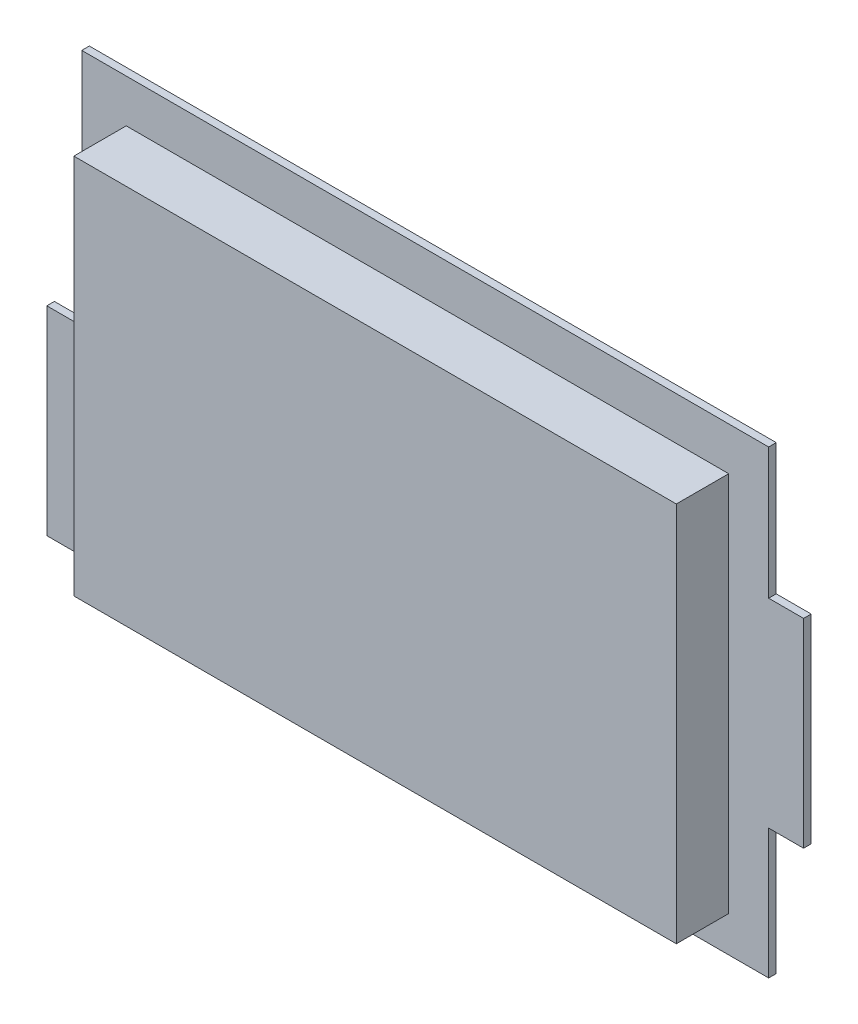
ISO-10303-21;
HEADER;
FILE_DESCRIPTION(('STEP AP214'),'2;1');
FILE_NAME('part.step','',(''),(''),'','','');
FILE_SCHEMA(('AUTOMOTIVE_DESIGN { 1 0 10303 214 1 1 1 1 }'));
ENDSEC;
DATA;
#1=APPLICATION_CONTEXT('core data for automotive mechanical design processes');
#2=APPLICATION_PROTOCOL_DEFINITION('international standard','automotive_design',2000,#1);
#3=PRODUCT_CONTEXT('',#1,'mechanical');
#4=PRODUCT('Part','Part','',(#3));
#5=PRODUCT_RELATED_PRODUCT_CATEGORY('part','',(#4));
#6=PRODUCT_DEFINITION_FORMATION('','',#4);
#7=PRODUCT_DEFINITION_CONTEXT('part definition',#1,'design');
#8=PRODUCT_DEFINITION('design','',#6,#7);
#9=PRODUCT_DEFINITION_SHAPE('','',#8);
#10=(LENGTH_UNIT() NAMED_UNIT(*) SI_UNIT(.MILLI.,.METRE.));
#11=(NAMED_UNIT(*) PLANE_ANGLE_UNIT() SI_UNIT($,.RADIAN.));
#12=(NAMED_UNIT(*) SI_UNIT($,.STERADIAN.) SOLID_ANGLE_UNIT());
#13=UNCERTAINTY_MEASURE_WITH_UNIT(LENGTH_MEASURE(1.E-05),#10,'distance_accuracy_value','');
#14=(GEOMETRIC_REPRESENTATION_CONTEXT(3) GLOBAL_UNCERTAINTY_ASSIGNED_CONTEXT((#13)) GLOBAL_UNIT_ASSIGNED_CONTEXT((#10,
#11,#12)) REPRESENTATION_CONTEXT('',''));
#15=CARTESIAN_POINT('',(0.,0.,0.));
#16=DIRECTION('',(0.,0.,1.));
#17=DIRECTION('',(1.,0.,0.));
#18=AXIS2_PLACEMENT_3D('',#15,#16,#17);
#19=CARTESIAN_POINT('',(0.493075847625734,-0.796661376953125,13.081));
#20=DIRECTION('',(0.,0.,1.));
#21=DIRECTION('',(1.,0.,0.));
#22=AXIS2_PLACEMENT_3D('',#19,#20,#21);
#23=PLANE('',#22);
#24=DIRECTION('',(1.,0.,0.));
#25=VECTOR('',#24,1.);
#26=CARTESIAN_POINT('',(0.493075847625732,-42.3482227325439,13.081));
#27=LINE('',#26,#25);
#28=CARTESIAN_POINT('',(66.2123870849609,-42.3482227325439,13.081));
#29=VERTEX_POINT('',#28);
#30=CARTESIAN_POINT('',(-65.2262353897095,-42.3482227325439,13.081));
#31=VERTEX_POINT('',#30);
#32=EDGE_CURVE('E176',#29,#31,#27,.F.);
#33=ORIENTED_EDGE('',*,*,#32,.F.);
#34=DIRECTION('',(0.,1.,0.));
#35=VECTOR('',#34,1.);
#36=CARTESIAN_POINT('',(66.2123870849609,-0.796661376953125,13.081));
#37=LINE('',#36,#35);
#38=CARTESIAN_POINT('',(66.2123870849609,40.7548999786377,13.081));
#39=VERTEX_POINT('',#38);
#40=EDGE_CURVE('E157',#39,#29,#37,.F.);
#41=ORIENTED_EDGE('',*,*,#40,.F.);
#42=DIRECTION('',(1.,0.,0.));
#43=VECTOR('',#42,1.);
#44=CARTESIAN_POINT('',(0.493075847625732,40.7548999786377,13.081));
#45=LINE('',#44,#43);
#46=CARTESIAN_POINT('',(-65.2262353897095,40.7548999786377,13.081));
#47=VERTEX_POINT('',#46);
#48=EDGE_CURVE('E19',#47,#39,#45,.T.);
#49=ORIENTED_EDGE('',*,*,#48,.F.);
#50=DIRECTION('',(0.,1.,0.));
#51=VECTOR('',#50,1.);
#52=CARTESIAN_POINT('',(-65.2262353897095,-0.796661376953125,13.081));
#53=LINE('',#52,#51);
#54=EDGE_CURVE('E188',#31,#47,#53,.T.);
#55=ORIENTED_EDGE('',*,*,#54,.F.);
#56=EDGE_LOOP('',(#33,#41,#49,#55));
#57=FACE_BOUND('',#56,.T.);
#58=ADVANCED_FACE('F16',(#57),#23,.T.);
#59=CARTESIAN_POINT('',(0.493075847625732,40.7548999786377,1.651));
#60=DIRECTION('',(0.,1.,0.));
#61=DIRECTION('',(0.,0.,1.));
#62=AXIS2_PLACEMENT_3D('',#59,#60,#61);
#63=PLANE('',#62);
#64=DIRECTION('',(1.,0.,0.));
#65=VECTOR('',#64,1.);
#66=CARTESIAN_POINT('',(0.,40.7548999786377,1.651));
#67=LINE('',#66,#65);
#68=CARTESIAN_POINT('',(-65.2262353897095,40.7548999786377,1.651));
#69=VERTEX_POINT('',#68);
#70=CARTESIAN_POINT('',(66.2123870849609,40.7548999786377,1.651));
#71=VERTEX_POINT('',#70);
#72=EDGE_CURVE('E197',#69,#71,#67,.T.);
#73=ORIENTED_EDGE('',*,*,#72,.F.);
#74=DIRECTION('',(0.,0.,1.));
#75=VECTOR('',#74,1.);
#76=CARTESIAN_POINT('',(-65.2262353897095,40.7548999786377,1.651));
#77=LINE('',#76,#75);
#78=EDGE_CURVE('E169',#47,#69,#77,.F.);
#79=ORIENTED_EDGE('',*,*,#78,.F.);
#80=ORIENTED_EDGE('',*,*,#48,.T.);
#81=DIRECTION('',(0.,0.,-1.));
#82=VECTOR('',#81,1.);
#83=CARTESIAN_POINT('',(66.2123870849609,40.7548999786377,1.651));
#84=LINE('',#83,#82);
#85=EDGE_CURVE('E167',#71,#39,#84,.F.);
#86=ORIENTED_EDGE('',*,*,#85,.F.);
#87=EDGE_LOOP('',(#73,#79,#80,#86));
#88=FACE_BOUND('',#87,.T.);
#89=ADVANCED_FACE('F166',(#88),#63,.T.);
#90=CARTESIAN_POINT('',(66.2123870849609,-0.796661376953125,1.651));
#91=DIRECTION('',(1.,0.,0.));
#92=DIRECTION('',(0.,0.,-1.));
#93=AXIS2_PLACEMENT_3D('',#90,#91,#92);
#94=PLANE('',#93);
#95=DIRECTION('',(0.,1.,0.));
#96=VECTOR('',#95,1.);
#97=CARTESIAN_POINT('',(66.2123870849609,0.,1.651));
#98=LINE('',#97,#96);
#99=CARTESIAN_POINT('',(66.2123870849609,-42.3482227325439,1.651));
#100=VERTEX_POINT('',#99);
#101=EDGE_CURVE('E174',#71,#100,#98,.F.);
#102=ORIENTED_EDGE('',*,*,#101,.F.);
#103=ORIENTED_EDGE('',*,*,#85,.T.);
#104=ORIENTED_EDGE('',*,*,#40,.T.);
#105=DIRECTION('',(0.,0.,-1.));
#106=VECTOR('',#105,1.);
#107=CARTESIAN_POINT('',(66.2123870849609,-42.3482227325439,1.651));
#108=LINE('',#107,#106);
#109=EDGE_CURVE('E185',#100,#29,#108,.F.);
#110=ORIENTED_EDGE('',*,*,#109,.F.);
#111=EDGE_LOOP('',(#102,#103,#104,#110));
#112=FACE_BOUND('',#111,.T.);
#113=ADVANCED_FACE('F173',(#112),#94,.T.);
#114=CARTESIAN_POINT('',(0.493075847625732,-42.3482227325439,1.651));
#115=DIRECTION('',(0.,-1.,0.));
#116=DIRECTION('',(0.,0.,-1.));
#117=AXIS2_PLACEMENT_3D('',#114,#115,#116);
#118=PLANE('',#117);
#119=DIRECTION('',(1.,0.,0.));
#120=VECTOR('',#119,1.);
#121=CARTESIAN_POINT('',(0.,-42.3482227325439,1.651));
#122=LINE('',#121,#120);
#123=CARTESIAN_POINT('',(-65.2262353897095,-42.3482227325439,1.651));
#124=VERTEX_POINT('',#123);
#125=EDGE_CURVE('E202',#100,#124,#122,.F.);
#126=ORIENTED_EDGE('',*,*,#125,.F.);
#127=ORIENTED_EDGE('',*,*,#109,.T.);
#128=ORIENTED_EDGE('',*,*,#32,.T.);
#129=DIRECTION('',(0.,0.,1.));
#130=VECTOR('',#129,1.);
#131=CARTESIAN_POINT('',(-65.2262353897095,-42.3482227325439,1.651));
#132=LINE('',#131,#130);
#133=EDGE_CURVE('E193',#124,#31,#132,.T.);
#134=ORIENTED_EDGE('',*,*,#133,.F.);
#135=EDGE_LOOP('',(#126,#127,#128,#134));
#136=FACE_BOUND('',#135,.T.);
#137=ADVANCED_FACE('F415',(#136),#118,.T.);
#138=CARTESIAN_POINT('',(-65.2262353897095,-0.796661376953125,1.651));
#139=DIRECTION('',(-1.,0.,0.));
#140=DIRECTION('',(0.,0.,1.));
#141=AXIS2_PLACEMENT_3D('',#138,#139,#140);
#142=PLANE('',#141);
#143=DIRECTION('',(0.,1.,0.));
#144=VECTOR('',#143,1.);
#145=CARTESIAN_POINT('',(-65.2262353897095,0.,1.651));
#146=LINE('',#145,#144);
#147=EDGE_CURVE('E205',#124,#69,#146,.T.);
#148=ORIENTED_EDGE('',*,*,#147,.F.);
#149=ORIENTED_EDGE('',*,*,#133,.T.);
#150=ORIENTED_EDGE('',*,*,#54,.T.);
#151=ORIENTED_EDGE('',*,*,#78,.T.);
#152=EDGE_LOOP('',(#148,#149,#150,#151));
#153=FACE_BOUND('',#152,.T.);
#154=ADVANCED_FACE('F411',(#153),#142,.T.);
#155=CARTESIAN_POINT('',(0.,0.,1.651));
#156=DIRECTION('',(0.,0.,1.));
#157=DIRECTION('',(1.,0.,0.));
#158=AXIS2_PLACEMENT_3D('',#155,#156,#157);
#159=PLANE('',#158);
#160=DIRECTION('',(1.,0.,0.));
#161=VECTOR('',#160,1.);
#162=CARTESIAN_POINT('',(78.74,21.59,1.651));
#163=LINE('',#162,#161);
#164=CARTESIAN_POINT('',(74.93,21.59,1.651));
#165=VERTEX_POINT('',#164);
#166=CARTESIAN_POINT('',(82.55,21.59,1.651));
#167=VERTEX_POINT('',#166);
#168=EDGE_CURVE('E254',#165,#167,#163,.T.);
#169=ORIENTED_EDGE('',*,*,#168,.F.);
#170=DIRECTION('',(0.,1.,0.));
#171=VECTOR('',#170,1.);
#172=CARTESIAN_POINT('',(74.93,0.,1.651));
#173=LINE('',#172,#171);
#174=CARTESIAN_POINT('',(74.93,50.165,1.651));
#175=VERTEX_POINT('',#174);
#176=EDGE_CURVE('E263',#175,#165,#173,.F.);
#177=ORIENTED_EDGE('',*,*,#176,.F.);
#178=DIRECTION('',(1.,0.,0.));
#179=VECTOR('',#178,1.);
#180=CARTESIAN_POINT('',(0.,50.165,1.651));
#181=LINE('',#180,#179);
#182=CARTESIAN_POINT('',(-74.93,50.165,1.651));
#183=VERTEX_POINT('',#182);
#184=EDGE_CURVE('E266',#183,#175,#181,.T.);
#185=ORIENTED_EDGE('',*,*,#184,.F.);
#186=DIRECTION('',(0.,1.,0.));
#187=VECTOR('',#186,1.);
#188=CARTESIAN_POINT('',(-74.93,0.,1.651));
#189=LINE('',#188,#187);
#190=CARTESIAN_POINT('',(-74.93,-1.905,1.651));
#191=VERTEX_POINT('',#190);
#192=EDGE_CURVE('E276',#191,#183,#189,.T.);
#193=ORIENTED_EDGE('',*,*,#192,.F.);
#194=DIRECTION('',(1.,0.,0.));
#195=VECTOR('',#194,1.);
#196=CARTESIAN_POINT('',(-78.74,-1.905,1.651));
#197=LINE('',#196,#195);
#198=CARTESIAN_POINT('',(-82.55,-1.905,1.651));
#199=VERTEX_POINT('',#198);
#200=EDGE_CURVE('E209',#199,#191,#197,.T.);
#201=ORIENTED_EDGE('',*,*,#200,.F.);
#202=DIRECTION('',(0.,1.,0.));
#203=VECTOR('',#202,1.);
#204=CARTESIAN_POINT('',(-82.55,-23.622,1.651));
#205=LINE('',#204,#203);
#206=CARTESIAN_POINT('',(-82.55,-45.339,1.651));
#207=VERTEX_POINT('',#206);
#208=EDGE_CURVE('E212',#207,#199,#205,.T.);
#209=ORIENTED_EDGE('',*,*,#208,.F.);
#210=DIRECTION('',(1.,0.,0.));
#211=VECTOR('',#210,1.);
#212=CARTESIAN_POINT('',(-78.74,-45.339,1.651));
#213=LINE('',#212,#211);
#214=CARTESIAN_POINT('',(-74.93,-45.339,1.651));
#215=VERTEX_POINT('',#214);
#216=EDGE_CURVE('E218',#215,#207,#213,.F.);
#217=ORIENTED_EDGE('',*,*,#216,.F.);
#218=DIRECTION('',(0.,1.,0.));
#219=VECTOR('',#218,1.);
#220=CARTESIAN_POINT('',(-74.93,0.,1.651));
#221=LINE('',#220,#219);
#222=CARTESIAN_POINT('',(-74.93,-50.165,1.651));
#223=VERTEX_POINT('',#222);
#224=EDGE_CURVE('E226',#223,#215,#221,.T.);
#225=ORIENTED_EDGE('',*,*,#224,.F.);
#226=DIRECTION('',(1.,0.,0.));
#227=VECTOR('',#226,1.);
#228=CARTESIAN_POINT('',(0.,-50.165,1.651));
#229=LINE('',#228,#227);
#230=CARTESIAN_POINT('',(74.93,-50.165,1.651));
#231=VERTEX_POINT('',#230);
#232=EDGE_CURVE('E230',#231,#223,#229,.F.);
#233=ORIENTED_EDGE('',*,*,#232,.F.);
#234=DIRECTION('',(0.,1.,0.));
#235=VECTOR('',#234,1.);
#236=CARTESIAN_POINT('',(74.93,0.,1.651));
#237=LINE('',#236,#235);
#238=CARTESIAN_POINT('',(74.93,-21.844,1.651));
#239=VERTEX_POINT('',#238);
#240=EDGE_CURVE('E236',#239,#231,#237,.F.);
#241=ORIENTED_EDGE('',*,*,#240,.F.);
#242=DIRECTION('',(1.,0.,0.));
#243=VECTOR('',#242,1.);
#244=CARTESIAN_POINT('',(78.74,-21.844,1.651));
#245=LINE('',#244,#243);
#246=CARTESIAN_POINT('',(82.55,-21.844,1.651));
#247=VERTEX_POINT('',#246);
#248=EDGE_CURVE('E242',#247,#239,#245,.F.);
#249=ORIENTED_EDGE('',*,*,#248,.F.);
#250=DIRECTION('',(0.,1.,0.));
#251=VECTOR('',#250,1.);
#252=CARTESIAN_POINT('',(82.55,-0.126999999999993,1.651));
#253=LINE('',#252,#251);
#254=EDGE_CURVE('E248',#167,#247,#253,.F.);
#255=ORIENTED_EDGE('',*,*,#254,.F.);
#256=EDGE_LOOP('',(#169,#177,#185,#193,#201,#209,#217,#225,#233,#241,#249,#255));
#257=FACE_BOUND('',#256,.T.);
#258=ORIENTED_EDGE('',*,*,#125,.T.);
#259=ORIENTED_EDGE('',*,*,#147,.T.);
#260=ORIENTED_EDGE('',*,*,#72,.T.);
#261=ORIENTED_EDGE('',*,*,#101,.T.);
#262=EDGE_LOOP('',(#258,#259,#260,#261));
#263=FACE_BOUND('',#262,.T.);
#264=ADVANCED_FACE('F408',(#257,#263),#159,.T.);
#265=CARTESIAN_POINT('',(-78.74,-1.905,0.));
#266=DIRECTION('',(0.,1.,0.));
#267=DIRECTION('',(0.,0.,1.));
#268=AXIS2_PLACEMENT_3D('',#265,#266,#267);
#269=PLANE('',#268);
#270=DIRECTION('',(1.,0.,0.));
#271=VECTOR('',#270,1.);
#272=CARTESIAN_POINT('',(0.,-1.905,0.));
#273=LINE('',#272,#271);
#274=CARTESIAN_POINT('',(-74.93,-1.905,0.));
#275=VERTEX_POINT('',#274);
#276=CARTESIAN_POINT('',(-82.55,-1.905,0.));
#277=VERTEX_POINT('',#276);
#278=EDGE_CURVE('E281',#275,#277,#273,.F.);
#279=ORIENTED_EDGE('',*,*,#278,.T.);
#280=DIRECTION('',(0.,0.,1.));
#281=VECTOR('',#280,1.);
#282=CARTESIAN_POINT('',(-82.55,-1.905,0.));
#283=LINE('',#282,#281);
#284=EDGE_CURVE('E215',#199,#277,#283,.F.);
#285=ORIENTED_EDGE('',*,*,#284,.F.);
#286=ORIENTED_EDGE('',*,*,#200,.T.);
#287=DIRECTION('',(0.,0.,1.));
#288=VECTOR('',#287,1.);
#289=CARTESIAN_POINT('',(-74.93,-1.905,0.));
#290=LINE('',#289,#288);
#291=EDGE_CURVE('E272',#275,#191,#290,.T.);
#292=ORIENTED_EDGE('',*,*,#291,.F.);
#293=EDGE_LOOP('',(#279,#285,#286,#292));
#294=FACE_BOUND('',#293,.T.);
#295=ADVANCED_FACE('F374',(#294),#269,.T.);
#296=CARTESIAN_POINT('',(-82.55,-23.622,0.));
#297=DIRECTION('',(-1.,0.,0.));
#298=DIRECTION('',(0.,0.,1.));
#299=AXIS2_PLACEMENT_3D('',#296,#297,#298);
#300=PLANE('',#299);
#301=DIRECTION('',(0.,1.,0.));
#302=VECTOR('',#301,1.);
#303=CARTESIAN_POINT('',(-82.55,0.,0.));
#304=LINE('',#303,#302);
#305=CARTESIAN_POINT('',(-82.55,-45.339,0.));
#306=VERTEX_POINT('',#305);
#307=EDGE_CURVE('E285',#277,#306,#304,.F.);
#308=ORIENTED_EDGE('',*,*,#307,.T.);
#309=DIRECTION('',(0.,0.,-1.));
#310=VECTOR('',#309,1.);
#311=CARTESIAN_POINT('',(-82.55,-45.339,0.));
#312=LINE('',#311,#310);
#313=EDGE_CURVE('E221',#207,#306,#312,.T.);
#314=ORIENTED_EDGE('',*,*,#313,.F.);
#315=ORIENTED_EDGE('',*,*,#208,.T.);
#316=ORIENTED_EDGE('',*,*,#284,.T.);
#317=EDGE_LOOP('',(#308,#314,#315,#316));
#318=FACE_BOUND('',#317,.T.);
#319=ADVANCED_FACE('F370',(#318),#300,.T.);
#320=CARTESIAN_POINT('',(-78.74,-45.339,0.));
#321=DIRECTION('',(0.,-1.,0.));
#322=DIRECTION('',(0.,0.,-1.));
#323=AXIS2_PLACEMENT_3D('',#320,#321,#322);
#324=PLANE('',#323);
#325=DIRECTION('',(1.,0.,0.));
#326=VECTOR('',#325,1.);
#327=CARTESIAN_POINT('',(0.,-45.339,0.));
#328=LINE('',#327,#326);
#329=CARTESIAN_POINT('',(-74.93,-45.339,0.));
#330=VERTEX_POINT('',#329);
#331=EDGE_CURVE('E289',#306,#330,#328,.T.);
#332=ORIENTED_EDGE('',*,*,#331,.T.);
#333=DIRECTION('',(0.,0.,1.));
#334=VECTOR('',#333,1.);
#335=CARTESIAN_POINT('',(-74.93,-45.339,0.));
#336=LINE('',#335,#334);
#337=EDGE_CURVE('E223',#215,#330,#336,.F.);
#338=ORIENTED_EDGE('',*,*,#337,.F.);
#339=ORIENTED_EDGE('',*,*,#216,.T.);
#340=ORIENTED_EDGE('',*,*,#313,.T.);
#341=EDGE_LOOP('',(#332,#338,#339,#340));
#342=FACE_BOUND('',#341,.T.);
#343=ADVANCED_FACE('F365',(#342),#324,.T.);
#344=CARTESIAN_POINT('',(-74.93,0.,0.));
#345=DIRECTION('',(-1.,0.,0.));
#346=DIRECTION('',(0.,0.,1.));
#347=AXIS2_PLACEMENT_3D('',#344,#345,#346);
#348=PLANE('',#347);
#349=DIRECTION('',(0.,0.,1.));
#350=VECTOR('',#349,1.);
#351=CARTESIAN_POINT('',(-74.93,-50.165,0.));
#352=LINE('',#351,#350);
#353=CARTESIAN_POINT('',(-74.93,-50.165,0.));
#354=VERTEX_POINT('',#353);
#355=EDGE_CURVE('E233',#223,#354,#352,.F.);
#356=ORIENTED_EDGE('',*,*,#355,.F.);
#357=ORIENTED_EDGE('',*,*,#224,.T.);
#358=ORIENTED_EDGE('',*,*,#337,.T.);
#359=DIRECTION('',(0.,1.,0.));
#360=VECTOR('',#359,1.);
#361=CARTESIAN_POINT('',(-74.93,0.,0.));
#362=LINE('',#361,#360);
#363=EDGE_CURVE('E293',#330,#354,#362,.F.);
#364=ORIENTED_EDGE('',*,*,#363,.T.);
#365=EDGE_LOOP('',(#356,#357,#358,#364));
#366=FACE_BOUND('',#365,.T.);
#367=ADVANCED_FACE('F362',(#366),#348,.T.);
#368=CARTESIAN_POINT('',(0.,-50.165,0.));
#369=DIRECTION('',(0.,-1.,0.));
#370=DIRECTION('',(1.,0.,0.));
#371=AXIS2_PLACEMENT_3D('',#368,#369,#370);
#372=PLANE('',#371);
#373=DIRECTION('',(1.,0.,0.));
#374=VECTOR('',#373,1.);
#375=CARTESIAN_POINT('',(0.,-50.165,0.));
#376=LINE('',#375,#374);
#377=CARTESIAN_POINT('',(74.93,-50.165,0.));
#378=VERTEX_POINT('',#377);
#379=EDGE_CURVE('E297',#354,#378,#376,.T.);
#380=ORIENTED_EDGE('',*,*,#379,.T.);
#381=DIRECTION('',(0.,0.,-1.));
#382=VECTOR('',#381,1.);
#383=CARTESIAN_POINT('',(74.93,-50.165,0.));
#384=LINE('',#383,#382);
#385=EDGE_CURVE('E239',#231,#378,#384,.T.);
#386=ORIENTED_EDGE('',*,*,#385,.F.);
#387=ORIENTED_EDGE('',*,*,#232,.T.);
#388=ORIENTED_EDGE('',*,*,#355,.T.);
#389=EDGE_LOOP('',(#380,#386,#387,#388));
#390=FACE_BOUND('',#389,.T.);
#391=ADVANCED_FACE('F356',(#390),#372,.T.);
#392=CARTESIAN_POINT('',(74.93,0.,0.));
#393=DIRECTION('',(1.,0.,0.));
#394=DIRECTION('',(0.,0.,-1.));
#395=AXIS2_PLACEMENT_3D('',#392,#393,#394);
#396=PLANE('',#395);
#397=ORIENTED_EDGE('',*,*,#385,.T.);
#398=DIRECTION('',(0.,1.,0.));
#399=VECTOR('',#398,1.);
#400=CARTESIAN_POINT('',(74.93,0.,0.));
#401=LINE('',#400,#399);
#402=CARTESIAN_POINT('',(74.93,-21.844,0.));
#403=VERTEX_POINT('',#402);
#404=EDGE_CURVE('E301',#378,#403,#401,.T.);
#405=ORIENTED_EDGE('',*,*,#404,.T.);
#406=DIRECTION('',(0.,0.,-1.));
#407=VECTOR('',#406,1.);
#408=CARTESIAN_POINT('',(74.93,-21.844,0.));
#409=LINE('',#408,#407);
#410=EDGE_CURVE('E245',#239,#403,#409,.T.);
#411=ORIENTED_EDGE('',*,*,#410,.F.);
#412=ORIENTED_EDGE('',*,*,#240,.T.);
#413=EDGE_LOOP('',(#397,#405,#411,#412));
#414=FACE_BOUND('',#413,.T.);
#415=ADVANCED_FACE('F352',(#414),#396,.T.);
#416=CARTESIAN_POINT('',(78.74,-21.844,0.));
#417=DIRECTION('',(0.,-1.,0.));
#418=DIRECTION('',(0.,0.,-1.));
#419=AXIS2_PLACEMENT_3D('',#416,#417,#418);
#420=PLANE('',#419);
#421=DIRECTION('',(1.,0.,0.));
#422=VECTOR('',#421,1.);
#423=CARTESIAN_POINT('',(0.,-21.844,0.));
#424=LINE('',#423,#422);
#425=CARTESIAN_POINT('',(82.55,-21.844,0.));
#426=VERTEX_POINT('',#425);
#427=EDGE_CURVE('E305',#403,#426,#424,.T.);
#428=ORIENTED_EDGE('',*,*,#427,.T.);
#429=DIRECTION('',(0.,0.,-1.));
#430=VECTOR('',#429,1.);
#431=CARTESIAN_POINT('',(82.55,-21.844,0.));
#432=LINE('',#431,#430);
#433=EDGE_CURVE('E251',#247,#426,#432,.T.);
#434=ORIENTED_EDGE('',*,*,#433,.F.);
#435=ORIENTED_EDGE('',*,*,#248,.T.);
#436=ORIENTED_EDGE('',*,*,#410,.T.);
#437=EDGE_LOOP('',(#428,#434,#435,#436));
#438=FACE_BOUND('',#437,.T.);
#439=ADVANCED_FACE('F346',(#438),#420,.T.);
#440=CARTESIAN_POINT('',(82.55,-0.126999999999993,0.));
#441=DIRECTION('',(1.,0.,0.));
#442=DIRECTION('',(0.,0.,-1.));
#443=AXIS2_PLACEMENT_3D('',#440,#441,#442);
#444=PLANE('',#443);
#445=DIRECTION('',(0.,1.,0.));
#446=VECTOR('',#445,1.);
#447=CARTESIAN_POINT('',(82.55,0.,0.));
#448=LINE('',#447,#446);
#449=CARTESIAN_POINT('',(82.55,21.59,0.));
#450=VERTEX_POINT('',#449);
#451=EDGE_CURVE('E309',#426,#450,#448,.T.);
#452=ORIENTED_EDGE('',*,*,#451,.T.);
#453=DIRECTION('',(0.,0.,1.));
#454=VECTOR('',#453,1.);
#455=CARTESIAN_POINT('',(82.55,21.59,0.));
#456=LINE('',#455,#454);
#457=EDGE_CURVE('E257',#167,#450,#456,.F.);
#458=ORIENTED_EDGE('',*,*,#457,.F.);
#459=ORIENTED_EDGE('',*,*,#254,.T.);
#460=ORIENTED_EDGE('',*,*,#433,.T.);
#461=EDGE_LOOP('',(#452,#458,#459,#460));
#462=FACE_BOUND('',#461,.T.);
#463=ADVANCED_FACE('F342',(#462),#444,.T.);
#464=CARTESIAN_POINT('',(78.74,21.59,0.));
#465=DIRECTION('',(0.,1.,0.));
#466=DIRECTION('',(0.,0.,1.));
#467=AXIS2_PLACEMENT_3D('',#464,#465,#466);
#468=PLANE('',#467);
#469=DIRECTION('',(1.,0.,0.));
#470=VECTOR('',#469,1.);
#471=CARTESIAN_POINT('',(0.,21.59,0.));
#472=LINE('',#471,#470);
#473=CARTESIAN_POINT('',(74.93,21.59,0.));
#474=VERTEX_POINT('',#473);
#475=EDGE_CURVE('E313',#450,#474,#472,.F.);
#476=ORIENTED_EDGE('',*,*,#475,.T.);
#477=DIRECTION('',(0.,0.,-1.));
#478=VECTOR('',#477,1.);
#479=CARTESIAN_POINT('',(74.93,21.59,0.));
#480=LINE('',#479,#478);
#481=EDGE_CURVE('E260',#165,#474,#480,.T.);
#482=ORIENTED_EDGE('',*,*,#481,.F.);
#483=ORIENTED_EDGE('',*,*,#168,.T.);
#484=ORIENTED_EDGE('',*,*,#457,.T.);
#485=EDGE_LOOP('',(#476,#482,#483,#484));
#486=FACE_BOUND('',#485,.T.);
#487=ADVANCED_FACE('F336',(#486),#468,.T.);
#488=CARTESIAN_POINT('',(74.93,0.,0.));
#489=DIRECTION('',(1.,0.,0.));
#490=DIRECTION('',(0.,0.,-1.));
#491=AXIS2_PLACEMENT_3D('',#488,#489,#490);
#492=PLANE('',#491);
#493=DIRECTION('',(0.,0.,1.));
#494=VECTOR('',#493,1.);
#495=CARTESIAN_POINT('',(74.93,50.165,0.));
#496=LINE('',#495,#494);
#497=CARTESIAN_POINT('',(74.93,50.165,0.));
#498=VERTEX_POINT('',#497);
#499=EDGE_CURVE('E269',#175,#498,#496,.F.);
#500=ORIENTED_EDGE('',*,*,#499,.F.);
#501=ORIENTED_EDGE('',*,*,#176,.T.);
#502=ORIENTED_EDGE('',*,*,#481,.T.);
#503=DIRECTION('',(0.,1.,0.));
#504=VECTOR('',#503,1.);
#505=CARTESIAN_POINT('',(74.93,0.,0.));
#506=LINE('',#505,#504);
#507=EDGE_CURVE('E317',#474,#498,#506,.T.);
#508=ORIENTED_EDGE('',*,*,#507,.T.);
#509=EDGE_LOOP('',(#500,#501,#502,#508));
#510=FACE_BOUND('',#509,.T.);
#511=ADVANCED_FACE('F332',(#510),#492,.T.);
#512=CARTESIAN_POINT('',(0.,50.165,0.));
#513=DIRECTION('',(0.,1.,0.));
#514=DIRECTION('',(0.,0.,1.));
#515=AXIS2_PLACEMENT_3D('',#512,#513,#514);
#516=PLANE('',#515);
#517=DIRECTION('',(1.,0.,0.));
#518=VECTOR('',#517,1.);
#519=CARTESIAN_POINT('',(0.,50.165,0.));
#520=LINE('',#519,#518);
#521=CARTESIAN_POINT('',(-74.93,50.165,0.));
#522=VERTEX_POINT('',#521);
#523=EDGE_CURVE('E26',#498,#522,#520,.F.);
#524=ORIENTED_EDGE('',*,*,#523,.T.);
#525=DIRECTION('',(0.,0.,1.));
#526=VECTOR('',#525,1.);
#527=CARTESIAN_POINT('',(-74.93,50.165,0.));
#528=LINE('',#527,#526);
#529=EDGE_CURVE('E38',#183,#522,#528,.F.);
#530=ORIENTED_EDGE('',*,*,#529,.F.);
#531=ORIENTED_EDGE('',*,*,#184,.T.);
#532=ORIENTED_EDGE('',*,*,#499,.T.);
#533=EDGE_LOOP('',(#524,#530,#531,#532));
#534=FACE_BOUND('',#533,.T.);
#535=ADVANCED_FACE('F325',(#534),#516,.T.);
#536=CARTESIAN_POINT('',(-74.93,0.,0.));
#537=DIRECTION('',(-1.,0.,0.));
#538=DIRECTION('',(0.,0.,1.));
#539=AXIS2_PLACEMENT_3D('',#536,#537,#538);
#540=PLANE('',#539);
#541=ORIENTED_EDGE('',*,*,#529,.T.);
#542=DIRECTION('',(0.,1.,0.));
#543=VECTOR('',#542,1.);
#544=CARTESIAN_POINT('',(-74.93,0.,0.));
#545=LINE('',#544,#543);
#546=EDGE_CURVE('E11',#522,#275,#545,.F.);
#547=ORIENTED_EDGE('',*,*,#546,.T.);
#548=ORIENTED_EDGE('',*,*,#291,.T.);
#549=ORIENTED_EDGE('',*,*,#192,.T.);
#550=EDGE_LOOP('',(#541,#547,#548,#549));
#551=FACE_BOUND('',#550,.T.);
#552=ADVANCED_FACE('F377',(#551),#540,.T.);
#553=CARTESIAN_POINT('',(0.,0.,0.));
#554=DIRECTION('',(0.,0.,1.));
#555=DIRECTION('',(1.,0.,0.));
#556=AXIS2_PLACEMENT_3D('',#553,#554,#555);
#557=PLANE('',#556);
#558=ORIENTED_EDGE('',*,*,#523,.F.);
#559=ORIENTED_EDGE('',*,*,#507,.F.);
#560=ORIENTED_EDGE('',*,*,#475,.F.);
#561=ORIENTED_EDGE('',*,*,#451,.F.);
#562=ORIENTED_EDGE('',*,*,#427,.F.);
#563=ORIENTED_EDGE('',*,*,#404,.F.);
#564=ORIENTED_EDGE('',*,*,#379,.F.);
#565=ORIENTED_EDGE('',*,*,#363,.F.);
#566=ORIENTED_EDGE('',*,*,#331,.F.);
#567=ORIENTED_EDGE('',*,*,#307,.F.);
#568=ORIENTED_EDGE('',*,*,#278,.F.);
#569=ORIENTED_EDGE('',*,*,#546,.F.);
#570=EDGE_LOOP('',(#558,#559,#560,#561,#562,#563,#564,#565,#566,#567,#568,#569));
#571=FACE_BOUND('',#570,.T.);
#572=ADVANCED_FACE('F329',(#571),#557,.F.);
#573=CLOSED_SHELL('',(#58,#89,#113,#137,#154,#264,#295,#319,#343,#367,#391,#415,#439,#463,#487,
#511,#535,#552,#572));
#574=MANIFOLD_SOLID_BREP('B1',#573);
#575=ADVANCED_BREP_SHAPE_REPRESENTATION('',(#18,#574),#14);
#576=SHAPE_DEFINITION_REPRESENTATION(#9,#575);
ENDSEC;
END-ISO-10303-21;
